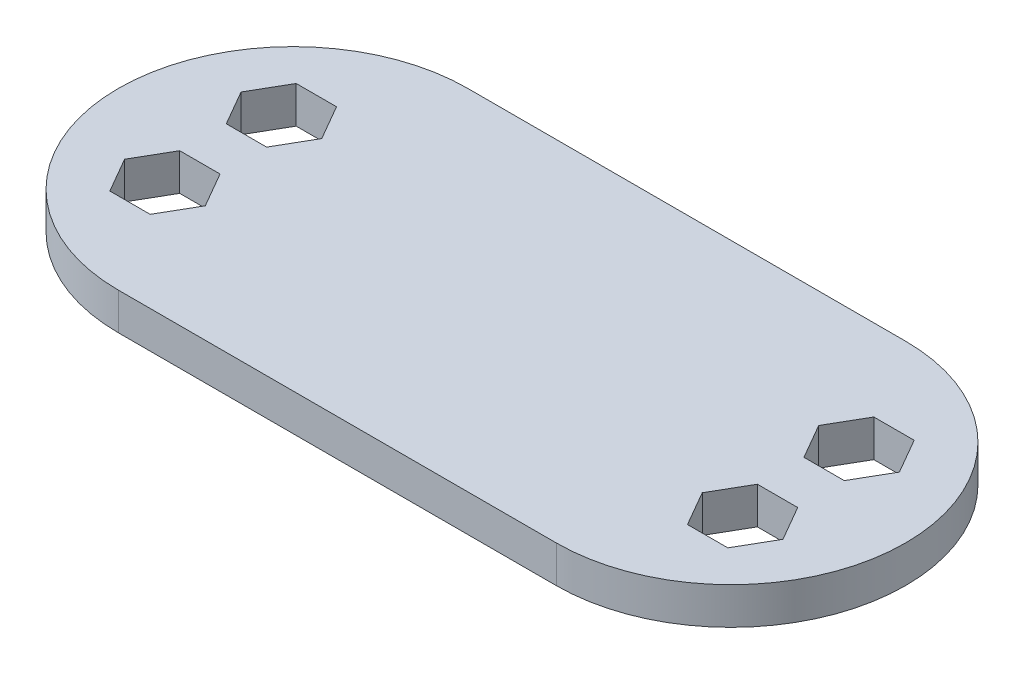
ISO-10303-21;
HEADER;
FILE_DESCRIPTION(('STEP AP214'),'2;1');
FILE_NAME('part.step','',(''),(''),'','','');
FILE_SCHEMA(('AUTOMOTIVE_DESIGN { 1 0 10303 214 1 1 1 1 }'));
ENDSEC;
DATA;
#1=APPLICATION_CONTEXT('core data for automotive mechanical design processes');
#2=APPLICATION_PROTOCOL_DEFINITION('international standard','automotive_design',2000,#1);
#3=PRODUCT_CONTEXT('',#1,'mechanical');
#4=PRODUCT('Part','Part','',(#3));
#5=PRODUCT_RELATED_PRODUCT_CATEGORY('part','',(#4));
#6=PRODUCT_DEFINITION_FORMATION('','',#4);
#7=PRODUCT_DEFINITION_CONTEXT('part definition',#1,'design');
#8=PRODUCT_DEFINITION('design','',#6,#7);
#9=PRODUCT_DEFINITION_SHAPE('','',#8);
#10=(LENGTH_UNIT() NAMED_UNIT(*) SI_UNIT(.MILLI.,.METRE.));
#11=(NAMED_UNIT(*) PLANE_ANGLE_UNIT() SI_UNIT($,.RADIAN.));
#12=(NAMED_UNIT(*) SI_UNIT($,.STERADIAN.) SOLID_ANGLE_UNIT());
#13=UNCERTAINTY_MEASURE_WITH_UNIT(LENGTH_MEASURE(1.E-05),#10,'distance_accuracy_value','');
#14=(GEOMETRIC_REPRESENTATION_CONTEXT(3) GLOBAL_UNCERTAINTY_ASSIGNED_CONTEXT((#13)) GLOBAL_UNIT_ASSIGNED_CONTEXT((#10,
#11,#12)) REPRESENTATION_CONTEXT('',''));
#15=CARTESIAN_POINT('',(0.,0.,0.));
#16=DIRECTION('',(0.,0.,1.));
#17=DIRECTION('',(1.,0.,0.));
#18=AXIS2_PLACEMENT_3D('',#15,#16,#17);
#19=CARTESIAN_POINT('',(-145.521414694939,3.175,14.0029406067574));
#20=DIRECTION('',(0.,1.,0.));
#21=DIRECTION('',(0.,0.,1.));
#22=AXIS2_PLACEMENT_3D('',#19,#20,#21);
#23=PLANE('',#22);
#24=CARTESIAN_POINT('',(-145.521414694939,3.175,14.0029406067574));
#25=DIRECTION('',(0.,1.,0.));
#26=DIRECTION('',(0.,0.,1.));
#27=AXIS2_PLACEMENT_3D('',#24,#25,#26);
#28=CIRCLE('',#27,15.);
#29=CARTESIAN_POINT('',(-145.521414694939,3.175,-0.997059393242624));
#30=VERTEX_POINT('',#29);
#31=CARTESIAN_POINT('',(-145.521414694939,3.175,29.0029406067574));
#32=VERTEX_POINT('',#31);
#33=EDGE_CURVE('E404',#30,#32,#28,.T.);
#34=ORIENTED_EDGE('',*,*,#33,.T.);
#35=DIRECTION('',(1.,0.,0.));
#36=VECTOR('',#35,1.);
#37=CARTESIAN_POINT('',(-145.521414694939,3.175,29.0029406067574));
#38=LINE('',#37,#36);
#39=CARTESIAN_POINT('',(-107.921414694939,3.175,29.0029406067574));
#40=VERTEX_POINT('',#39);
#41=EDGE_CURVE('E407',#32,#40,#38,.T.);
#42=ORIENTED_EDGE('',*,*,#41,.T.);
#43=CARTESIAN_POINT('',(-107.921414694939,3.175,14.0029406067574));
#44=DIRECTION('',(0.,1.,0.));
#45=DIRECTION('',(0.,0.,1.));
#46=AXIS2_PLACEMENT_3D('',#43,#44,#45);
#47=CIRCLE('',#46,15.);
#48=CARTESIAN_POINT('',(-107.921414694939,3.175,-0.997059393242629));
#49=VERTEX_POINT('',#48);
#50=EDGE_CURVE('E410',#40,#49,#47,.T.);
#51=ORIENTED_EDGE('',*,*,#50,.T.);
#52=DIRECTION('',(-1.,0.,0.));
#53=VECTOR('',#52,1.);
#54=CARTESIAN_POINT('',(-145.521414694939,3.175,-0.997059393242624));
#55=LINE('',#54,#53);
#56=EDGE_CURVE('E412',#49,#30,#55,.T.);
#57=ORIENTED_EDGE('',*,*,#56,.T.);
#58=EDGE_LOOP('',(#34,#42,#51,#57));
#59=FACE_BOUND('',#58,.T.);
#60=DIRECTION('',(0.500000000000001,0.,0.866025403784438));
#61=VECTOR('',#60,1.);
#62=CARTESIAN_POINT('',(-153.253465502508,3.175,22.0029406067574));
#63=LINE('',#62,#61);
#64=CARTESIAN_POINT('',(-154.985516310076,3.175,19.0029406067574));
#65=VERTEX_POINT('',#64);
#66=CARTESIAN_POINT('',(-153.253465502508,3.175,22.0029406067574));
#67=VERTEX_POINT('',#66);
#68=EDGE_CURVE('E361',#65,#67,#63,.T.);
#69=ORIENTED_EDGE('',*,*,#68,.F.);
#70=DIRECTION('',(-0.499999999999997,0.,0.86602540378444));
#71=VECTOR('',#70,1.);
#72=CARTESIAN_POINT('',(-154.985516310076,3.175,19.0029406067574));
#73=LINE('',#72,#71);
#74=CARTESIAN_POINT('',(-153.253465502508,3.175,16.0029406067574));
#75=VERTEX_POINT('',#74);
#76=EDGE_CURVE('E359',#75,#65,#73,.T.);
#77=ORIENTED_EDGE('',*,*,#76,.F.);
#78=DIRECTION('',(-1.,0.,0.));
#79=VECTOR('',#78,1.);
#80=CARTESIAN_POINT('',(-153.253465502508,3.175,16.0029406067574));
#81=LINE('',#80,#79);
#82=CARTESIAN_POINT('',(-149.78936388737,3.175,16.0029406067574));
#83=VERTEX_POINT('',#82);
#84=EDGE_CURVE('E371',#83,#75,#81,.T.);
#85=ORIENTED_EDGE('',*,*,#84,.F.);
#86=DIRECTION('',(-0.500000000000003,0.,-0.866025403784437));
#87=VECTOR('',#86,1.);
#88=CARTESIAN_POINT('',(-149.78936388737,3.175,16.0029406067574));
#89=LINE('',#88,#87);
#90=CARTESIAN_POINT('',(-148.057313079801,3.175,19.0029406067574));
#91=VERTEX_POINT('',#90);
#92=EDGE_CURVE('E368',#91,#83,#89,.T.);
#93=ORIENTED_EDGE('',*,*,#92,.F.);
#94=DIRECTION('',(0.500000000000002,0.,-0.866025403784437));
#95=VECTOR('',#94,1.);
#96=CARTESIAN_POINT('',(-148.057313079801,3.175,19.0029406067574));
#97=LINE('',#96,#95);
#98=CARTESIAN_POINT('',(-149.78936388737,3.175,22.0029406067574));
#99=VERTEX_POINT('',#98);
#100=EDGE_CURVE('E366',#99,#91,#97,.T.);
#101=ORIENTED_EDGE('',*,*,#100,.F.);
#102=DIRECTION('',(1.,0.,0.));
#103=VECTOR('',#102,1.);
#104=CARTESIAN_POINT('',(-149.78936388737,3.175,22.0029406067574));
#105=LINE('',#104,#103);
#106=EDGE_CURVE('E364',#67,#99,#105,.T.);
#107=ORIENTED_EDGE('',*,*,#106,.F.);
#108=EDGE_LOOP('',(#69,#77,#85,#93,#101,#107));
#109=FACE_BOUND('',#108,.T.);
#110=DIRECTION('',(0.500000000000003,0.,-0.866025403784437));
#111=VECTOR('',#110,1.);
#112=CARTESIAN_POINT('',(-149.78936388737,3.175,12.0029406067574));
#113=LINE('',#112,#111);
#114=CARTESIAN_POINT('',(-149.78936388737,3.175,12.0029406067574));
#115=VERTEX_POINT('',#114);
#116=CARTESIAN_POINT('',(-148.057313079801,3.175,9.00294060675738));
#117=VERTEX_POINT('',#116);
#118=EDGE_CURVE('E316',#115,#117,#113,.T.);
#119=ORIENTED_EDGE('',*,*,#118,.F.);
#120=DIRECTION('',(1.,0.,0.));
#121=VECTOR('',#120,1.);
#122=CARTESIAN_POINT('',(-153.253465502508,3.175,12.0029406067574));
#123=LINE('',#122,#121);
#124=CARTESIAN_POINT('',(-153.253465502508,3.175,12.0029406067574));
#125=VERTEX_POINT('',#124);
#126=EDGE_CURVE('E314',#125,#115,#123,.T.);
#127=ORIENTED_EDGE('',*,*,#126,.F.);
#128=DIRECTION('',(0.499999999999997,0.,0.86602540378444));
#129=VECTOR('',#128,1.);
#130=CARTESIAN_POINT('',(-154.985516310076,3.175,9.00294060675738));
#131=LINE('',#130,#129);
#132=CARTESIAN_POINT('',(-154.985516310076,3.175,9.00294060675738));
#133=VERTEX_POINT('',#132);
#134=EDGE_CURVE('E326',#133,#125,#131,.T.);
#135=ORIENTED_EDGE('',*,*,#134,.F.);
#136=DIRECTION('',(-0.500000000000001,0.,0.866025403784438));
#137=VECTOR('',#136,1.);
#138=CARTESIAN_POINT('',(-153.253465502508,3.175,6.00294060675738));
#139=LINE('',#138,#137);
#140=CARTESIAN_POINT('',(-153.253465502508,3.175,6.00294060675738));
#141=VERTEX_POINT('',#140);
#142=EDGE_CURVE('E323',#141,#133,#139,.T.);
#143=ORIENTED_EDGE('',*,*,#142,.F.);
#144=DIRECTION('',(-1.,0.,0.));
#145=VECTOR('',#144,1.);
#146=CARTESIAN_POINT('',(-149.78936388737,3.175,6.00294060675738));
#147=LINE('',#146,#145);
#148=CARTESIAN_POINT('',(-149.78936388737,3.175,6.00294060675738));
#149=VERTEX_POINT('',#148);
#150=EDGE_CURVE('E321',#149,#141,#147,.T.);
#151=ORIENTED_EDGE('',*,*,#150,.F.);
#152=DIRECTION('',(-0.500000000000002,0.,-0.866025403784437));
#153=VECTOR('',#152,1.);
#154=CARTESIAN_POINT('',(-148.057313079801,3.175,9.00294060675738));
#155=LINE('',#154,#153);
#156=EDGE_CURVE('E319',#117,#149,#155,.T.);
#157=ORIENTED_EDGE('',*,*,#156,.F.);
#158=EDGE_LOOP('',(#119,#127,#135,#143,#151,#157));
#159=FACE_BOUND('',#158,.T.);
#160=DIRECTION('',(-0.500000000000003,0.,0.866025403784437));
#161=VECTOR('',#160,1.);
#162=CARTESIAN_POINT('',(-103.653465502508,3.175,16.0029406067574));
#163=LINE('',#162,#161);
#164=CARTESIAN_POINT('',(-103.653465502508,3.175,16.0029406067574));
#165=VERTEX_POINT('',#164);
#166=CARTESIAN_POINT('',(-105.385516310076,3.175,19.0029406067574));
#167=VERTEX_POINT('',#166);
#168=EDGE_CURVE('E271',#165,#167,#163,.T.);
#169=ORIENTED_EDGE('',*,*,#168,.F.);
#170=DIRECTION('',(-1.,0.,0.));
#171=VECTOR('',#170,1.);
#172=CARTESIAN_POINT('',(-100.18936388737,3.175,16.0029406067574));
#173=LINE('',#172,#171);
#174=CARTESIAN_POINT('',(-100.18936388737,3.175,16.0029406067574));
#175=VERTEX_POINT('',#174);
#176=EDGE_CURVE('E269',#175,#165,#173,.T.);
#177=ORIENTED_EDGE('',*,*,#176,.F.);
#178=DIRECTION('',(-0.499999999999997,0.,-0.86602540378444));
#179=VECTOR('',#178,1.);
#180=CARTESIAN_POINT('',(-98.4573130798009,3.175,19.0029406067574));
#181=LINE('',#180,#179);
#182=CARTESIAN_POINT('',(-98.457313079801,3.175,19.0029406067574));
#183=VERTEX_POINT('',#182);
#184=EDGE_CURVE('E281',#183,#175,#181,.T.);
#185=ORIENTED_EDGE('',*,*,#184,.F.);
#186=DIRECTION('',(0.500000000000001,0.,-0.866025403784438));
#187=VECTOR('',#186,1.);
#188=CARTESIAN_POINT('',(-100.18936388737,3.175,22.0029406067574));
#189=LINE('',#188,#187);
#190=CARTESIAN_POINT('',(-100.18936388737,3.175,22.0029406067574));
#191=VERTEX_POINT('',#190);
#192=EDGE_CURVE('E278',#191,#183,#189,.T.);
#193=ORIENTED_EDGE('',*,*,#192,.F.);
#194=DIRECTION('',(1.,0.,0.));
#195=VECTOR('',#194,1.);
#196=CARTESIAN_POINT('',(-103.653465502508,3.175,22.0029406067574));
#197=LINE('',#196,#195);
#198=CARTESIAN_POINT('',(-103.653465502508,3.175,22.0029406067574));
#199=VERTEX_POINT('',#198);
#200=EDGE_CURVE('E276',#199,#191,#197,.T.);
#201=ORIENTED_EDGE('',*,*,#200,.F.);
#202=DIRECTION('',(0.500000000000002,0.,0.866025403784437));
#203=VECTOR('',#202,1.);
#204=CARTESIAN_POINT('',(-105.385516310076,3.175,19.0029406067574));
#205=LINE('',#204,#203);
#206=EDGE_CURVE('E274',#167,#199,#205,.T.);
#207=ORIENTED_EDGE('',*,*,#206,.F.);
#208=EDGE_LOOP('',(#169,#177,#185,#193,#201,#207));
#209=FACE_BOUND('',#208,.T.);
#210=DIRECTION('',(-0.500000000000001,0.,-0.866025403784438));
#211=VECTOR('',#210,1.);
#212=CARTESIAN_POINT('',(-100.18936388737,3.175,6.00294060675738));
#213=LINE('',#212,#211);
#214=CARTESIAN_POINT('',(-98.4573130798009,3.175,9.00294060675738));
#215=VERTEX_POINT('',#214);
#216=CARTESIAN_POINT('',(-100.18936388737,3.175,6.00294060675738));
#217=VERTEX_POINT('',#216);
#218=EDGE_CURVE('E226',#215,#217,#213,.T.);
#219=ORIENTED_EDGE('',*,*,#218,.F.);
#220=DIRECTION('',(0.499999999999997,0.,-0.86602540378444));
#221=VECTOR('',#220,1.);
#222=CARTESIAN_POINT('',(-98.4573130798009,3.175,9.00294060675738));
#223=LINE('',#222,#221);
#224=CARTESIAN_POINT('',(-100.18936388737,3.175,12.0029406067574));
#225=VERTEX_POINT('',#224);
#226=EDGE_CURVE('E218',#225,#215,#223,.T.);
#227=ORIENTED_EDGE('',*,*,#226,.F.);
#228=DIRECTION('',(1.,0.,0.));
#229=VECTOR('',#228,1.);
#230=CARTESIAN_POINT('',(-100.18936388737,3.175,12.0029406067574));
#231=LINE('',#230,#229);
#232=CARTESIAN_POINT('',(-103.653465502508,3.175,12.0029406067574));
#233=VERTEX_POINT('',#232);
#234=EDGE_CURVE('E247',#233,#225,#231,.T.);
#235=ORIENTED_EDGE('',*,*,#234,.F.);
#236=DIRECTION('',(0.500000000000003,0.,0.866025403784437));
#237=VECTOR('',#236,1.);
#238=CARTESIAN_POINT('',(-103.653465502508,3.175,12.0029406067574));
#239=LINE('',#238,#237);
#240=CARTESIAN_POINT('',(-105.385516310076,3.175,9.00294060675738));
#241=VERTEX_POINT('',#240);
#242=EDGE_CURVE('E245',#241,#233,#239,.T.);
#243=ORIENTED_EDGE('',*,*,#242,.F.);
#244=DIRECTION('',(-0.500000000000002,0.,0.866025403784437));
#245=VECTOR('',#244,1.);
#246=CARTESIAN_POINT('',(-105.385516310076,3.175,9.00294060675738));
#247=LINE('',#246,#245);
#248=CARTESIAN_POINT('',(-103.653465502508,3.175,6.00294060675738));
#249=VERTEX_POINT('',#248);
#250=EDGE_CURVE('E241',#249,#241,#247,.T.);
#251=ORIENTED_EDGE('',*,*,#250,.F.);
#252=DIRECTION('',(-1.,0.,0.));
#253=VECTOR('',#252,1.);
#254=CARTESIAN_POINT('',(-103.653465502508,3.175,6.00294060675738));
#255=LINE('',#254,#253);
#256=EDGE_CURVE('E239',#217,#249,#255,.T.);
#257=ORIENTED_EDGE('',*,*,#256,.F.);
#258=EDGE_LOOP('',(#219,#227,#235,#243,#251,#257));
#259=FACE_BOUND('',#258,.T.);
#260=ADVANCED_FACE('F33',(#59,#109,#159,#209,#259),#23,.T.);
#261=CARTESIAN_POINT('',(-145.521414694939,0.,14.0029406067574));
#262=DIRECTION('',(0.,1.,0.));
#263=DIRECTION('',(0.,0.,1.));
#264=AXIS2_PLACEMENT_3D('',#261,#262,#263);
#265=PLANE('',#264);
#266=DIRECTION('',(-1.,0.,0.));
#267=VECTOR('',#266,1.);
#268=CARTESIAN_POINT('',(-100.18936388737,0.,16.0029406067574));
#269=LINE('',#268,#267);
#270=CARTESIAN_POINT('',(-100.18936388737,0.,16.0029406067574));
#271=VERTEX_POINT('',#270);
#272=CARTESIAN_POINT('',(-103.653465502508,0.,16.0029406067574));
#273=VERTEX_POINT('',#272);
#274=EDGE_CURVE('E234',#271,#273,#269,.T.);
#275=ORIENTED_EDGE('',*,*,#274,.T.);
#276=DIRECTION('',(-0.500000000000003,0.,0.866025403784437));
#277=VECTOR('',#276,1.);
#278=CARTESIAN_POINT('',(-103.653465502508,0.,16.0029406067574));
#279=LINE('',#278,#277);
#280=CARTESIAN_POINT('',(-105.385516310076,0.,19.0029406067574));
#281=VERTEX_POINT('',#280);
#282=EDGE_CURVE('E286',#273,#281,#279,.T.);
#283=ORIENTED_EDGE('',*,*,#282,.T.);
#284=DIRECTION('',(0.500000000000002,0.,0.866025403784437));
#285=VECTOR('',#284,1.);
#286=CARTESIAN_POINT('',(-105.385516310076,0.,19.0029406067574));
#287=LINE('',#286,#285);
#288=CARTESIAN_POINT('',(-103.653465502508,0.,22.0029406067574));
#289=VERTEX_POINT('',#288);
#290=EDGE_CURVE('E289',#281,#289,#287,.T.);
#291=ORIENTED_EDGE('',*,*,#290,.T.);
#292=DIRECTION('',(1.,0.,0.));
#293=VECTOR('',#292,1.);
#294=CARTESIAN_POINT('',(-103.653465502508,0.,22.0029406067574));
#295=LINE('',#294,#293);
#296=CARTESIAN_POINT('',(-100.18936388737,0.,22.0029406067574));
#297=VERTEX_POINT('',#296);
#298=EDGE_CURVE('E292',#289,#297,#295,.T.);
#299=ORIENTED_EDGE('',*,*,#298,.T.);
#300=DIRECTION('',(0.500000000000001,0.,-0.866025403784438));
#301=VECTOR('',#300,1.);
#302=CARTESIAN_POINT('',(-100.18936388737,0.,22.0029406067574));
#303=LINE('',#302,#301);
#304=CARTESIAN_POINT('',(-98.4573130798009,0.,19.0029406067574));
#305=VERTEX_POINT('',#304);
#306=EDGE_CURVE('E295',#297,#305,#303,.T.);
#307=ORIENTED_EDGE('',*,*,#306,.T.);
#308=DIRECTION('',(-0.499999999999997,0.,-0.86602540378444));
#309=VECTOR('',#308,1.);
#310=CARTESIAN_POINT('',(-98.4573130798009,0.,19.0029406067574));
#311=LINE('',#310,#309);
#312=EDGE_CURVE('E272',#305,#271,#311,.T.);
#313=ORIENTED_EDGE('',*,*,#312,.T.);
#314=EDGE_LOOP('',(#275,#283,#291,#299,#307,#313));
#315=FACE_BOUND('',#314,.T.);
#316=DIRECTION('',(-0.499999999999997,0.,0.86602540378444));
#317=VECTOR('',#316,1.);
#318=CARTESIAN_POINT('',(-154.985516310076,0.,19.0029406067574));
#319=LINE('',#318,#317);
#320=CARTESIAN_POINT('',(-153.253465502508,0.,16.0029406067574));
#321=VERTEX_POINT('',#320);
#322=CARTESIAN_POINT('',(-154.985516310076,0.,19.0029406067574));
#323=VERTEX_POINT('',#322);
#324=EDGE_CURVE('E358',#321,#323,#319,.T.);
#325=ORIENTED_EDGE('',*,*,#324,.T.);
#326=DIRECTION('',(0.500000000000001,0.,0.866025403784438));
#327=VECTOR('',#326,1.);
#328=CARTESIAN_POINT('',(-153.253465502508,0.,22.0029406067574));
#329=LINE('',#328,#327);
#330=CARTESIAN_POINT('',(-153.253465502508,0.,22.0029406067574));
#331=VERTEX_POINT('',#330);
#332=EDGE_CURVE('E376',#323,#331,#329,.T.);
#333=ORIENTED_EDGE('',*,*,#332,.T.);
#334=DIRECTION('',(1.,0.,0.));
#335=VECTOR('',#334,1.);
#336=CARTESIAN_POINT('',(-149.78936388737,0.,22.0029406067574));
#337=LINE('',#336,#335);
#338=CARTESIAN_POINT('',(-149.78936388737,0.,22.0029406067574));
#339=VERTEX_POINT('',#338);
#340=EDGE_CURVE('E379',#331,#339,#337,.T.);
#341=ORIENTED_EDGE('',*,*,#340,.T.);
#342=DIRECTION('',(0.500000000000002,0.,-0.866025403784437));
#343=VECTOR('',#342,1.);
#344=CARTESIAN_POINT('',(-148.057313079801,0.,19.0029406067574));
#345=LINE('',#344,#343);
#346=CARTESIAN_POINT('',(-148.057313079801,0.,19.0029406067574));
#347=VERTEX_POINT('',#346);
#348=EDGE_CURVE('E382',#339,#347,#345,.T.);
#349=ORIENTED_EDGE('',*,*,#348,.T.);
#350=DIRECTION('',(-0.500000000000003,0.,-0.866025403784437));
#351=VECTOR('',#350,1.);
#352=CARTESIAN_POINT('',(-149.78936388737,0.,16.0029406067574));
#353=LINE('',#352,#351);
#354=CARTESIAN_POINT('',(-149.78936388737,0.,16.0029406067574));
#355=VERTEX_POINT('',#354);
#356=EDGE_CURVE('E385',#347,#355,#353,.T.);
#357=ORIENTED_EDGE('',*,*,#356,.T.);
#358=DIRECTION('',(-1.,0.,0.));
#359=VECTOR('',#358,1.);
#360=CARTESIAN_POINT('',(-153.253465502508,0.,16.0029406067574));
#361=LINE('',#360,#359);
#362=EDGE_CURVE('E362',#355,#321,#361,.T.);
#363=ORIENTED_EDGE('',*,*,#362,.T.);
#364=EDGE_LOOP('',(#325,#333,#341,#349,#357,#363));
#365=FACE_BOUND('',#364,.T.);
#366=CARTESIAN_POINT('',(-145.521414694939,0.,14.0029406067574));
#367=DIRECTION('',(0.,1.,0.));
#368=DIRECTION('',(0.,0.,1.));
#369=AXIS2_PLACEMENT_3D('',#366,#367,#368);
#370=CIRCLE('',#369,15.);
#371=CARTESIAN_POINT('',(-145.521414694939,0.,-0.997059393242624));
#372=VERTEX_POINT('',#371);
#373=CARTESIAN_POINT('',(-145.521414694939,0.,29.0029406067574));
#374=VERTEX_POINT('',#373);
#375=EDGE_CURVE('E403',#372,#374,#370,.T.);
#376=ORIENTED_EDGE('',*,*,#375,.F.);
#377=DIRECTION('',(-1.,0.,0.));
#378=VECTOR('',#377,1.);
#379=CARTESIAN_POINT('',(-145.521414694939,0.,-0.997059393242624));
#380=LINE('',#379,#378);
#381=CARTESIAN_POINT('',(-107.921414694939,0.,-0.997059393242629));
#382=VERTEX_POINT('',#381);
#383=EDGE_CURVE('E408',#382,#372,#380,.T.);
#384=ORIENTED_EDGE('',*,*,#383,.F.);
#385=CARTESIAN_POINT('',(-107.921414694939,0.,14.0029406067574));
#386=DIRECTION('',(0.,1.,0.));
#387=DIRECTION('',(0.,0.,1.));
#388=AXIS2_PLACEMENT_3D('',#385,#386,#387);
#389=CIRCLE('',#388,15.);
#390=CARTESIAN_POINT('',(-107.921414694939,0.,29.0029406067574));
#391=VERTEX_POINT('',#390);
#392=EDGE_CURVE('E419',#391,#382,#389,.T.);
#393=ORIENTED_EDGE('',*,*,#392,.F.);
#394=DIRECTION('',(1.,0.,0.));
#395=VECTOR('',#394,1.);
#396=CARTESIAN_POINT('',(-145.521414694939,0.,29.0029406067574));
#397=LINE('',#396,#395);
#398=EDGE_CURVE('E417',#374,#391,#397,.T.);
#399=ORIENTED_EDGE('',*,*,#398,.F.);
#400=EDGE_LOOP('',(#376,#384,#393,#399));
#401=FACE_BOUND('',#400,.T.);
#402=DIRECTION('',(1.,0.,0.));
#403=VECTOR('',#402,1.);
#404=CARTESIAN_POINT('',(-153.253465502508,0.,12.0029406067574));
#405=LINE('',#404,#403);
#406=CARTESIAN_POINT('',(-153.253465502508,0.,12.0029406067574));
#407=VERTEX_POINT('',#406);
#408=CARTESIAN_POINT('',(-149.78936388737,0.,12.0029406067574));
#409=VERTEX_POINT('',#408);
#410=EDGE_CURVE('E313',#407,#409,#405,.T.);
#411=ORIENTED_EDGE('',*,*,#410,.T.);
#412=DIRECTION('',(0.500000000000003,0.,-0.866025403784437));
#413=VECTOR('',#412,1.);
#414=CARTESIAN_POINT('',(-149.78936388737,0.,12.0029406067574));
#415=LINE('',#414,#413);
#416=CARTESIAN_POINT('',(-148.057313079801,0.,9.00294060675738));
#417=VERTEX_POINT('',#416);
#418=EDGE_CURVE('E331',#409,#417,#415,.T.);
#419=ORIENTED_EDGE('',*,*,#418,.T.);
#420=DIRECTION('',(-0.500000000000002,0.,-0.866025403784437));
#421=VECTOR('',#420,1.);
#422=CARTESIAN_POINT('',(-148.057313079801,0.,9.00294060675738));
#423=LINE('',#422,#421);
#424=CARTESIAN_POINT('',(-149.78936388737,0.,6.00294060675738));
#425=VERTEX_POINT('',#424);
#426=EDGE_CURVE('E334',#417,#425,#423,.T.);
#427=ORIENTED_EDGE('',*,*,#426,.T.);
#428=DIRECTION('',(-1.,0.,0.));
#429=VECTOR('',#428,1.);
#430=CARTESIAN_POINT('',(-149.78936388737,0.,6.00294060675738));
#431=LINE('',#430,#429);
#432=CARTESIAN_POINT('',(-153.253465502508,0.,6.00294060675738));
#433=VERTEX_POINT('',#432);
#434=EDGE_CURVE('E337',#425,#433,#431,.T.);
#435=ORIENTED_EDGE('',*,*,#434,.T.);
#436=DIRECTION('',(-0.500000000000001,0.,0.866025403784438));
#437=VECTOR('',#436,1.);
#438=CARTESIAN_POINT('',(-153.253465502508,0.,6.00294060675738));
#439=LINE('',#438,#437);
#440=CARTESIAN_POINT('',(-154.985516310076,0.,9.00294060675738));
#441=VERTEX_POINT('',#440);
#442=EDGE_CURVE('E340',#433,#441,#439,.T.);
#443=ORIENTED_EDGE('',*,*,#442,.T.);
#444=DIRECTION('',(0.499999999999997,0.,0.86602540378444));
#445=VECTOR('',#444,1.);
#446=CARTESIAN_POINT('',(-154.985516310076,0.,9.00294060675738));
#447=LINE('',#446,#445);
#448=EDGE_CURVE('E317',#441,#407,#447,.T.);
#449=ORIENTED_EDGE('',*,*,#448,.T.);
#450=EDGE_LOOP('',(#411,#419,#427,#435,#443,#449));
#451=FACE_BOUND('',#450,.T.);
#452=DIRECTION('',(0.499999999999997,0.,-0.86602540378444));
#453=VECTOR('',#452,1.);
#454=CARTESIAN_POINT('',(-98.4573130798009,0.,9.00294060675738));
#455=LINE('',#454,#453);
#456=CARTESIAN_POINT('',(-100.18936388737,0.,12.0029406067574));
#457=VERTEX_POINT('',#456);
#458=CARTESIAN_POINT('',(-98.4573130798009,0.,9.00294060675738));
#459=VERTEX_POINT('',#458);
#460=EDGE_CURVE('E56',#457,#459,#455,.T.);
#461=ORIENTED_EDGE('',*,*,#460,.T.);
#462=DIRECTION('',(-0.500000000000001,0.,-0.866025403784438));
#463=VECTOR('',#462,1.);
#464=CARTESIAN_POINT('',(-100.18936388737,0.,6.00294060675738));
#465=LINE('',#464,#463);
#466=CARTESIAN_POINT('',(-100.18936388737,0.,6.00294060675738));
#467=VERTEX_POINT('',#466);
#468=EDGE_CURVE('E233',#459,#467,#465,.T.);
#469=ORIENTED_EDGE('',*,*,#468,.T.);
#470=DIRECTION('',(-1.,0.,0.));
#471=VECTOR('',#470,1.);
#472=CARTESIAN_POINT('',(-103.653465502508,0.,6.00294060675738));
#473=LINE('',#472,#471);
#474=CARTESIAN_POINT('',(-103.653465502508,0.,6.00294060675738));
#475=VERTEX_POINT('',#474);
#476=EDGE_CURVE('E251',#467,#475,#473,.T.);
#477=ORIENTED_EDGE('',*,*,#476,.T.);
#478=DIRECTION('',(-0.500000000000002,0.,0.866025403784437));
#479=VECTOR('',#478,1.);
#480=CARTESIAN_POINT('',(-105.385516310076,0.,9.00294060675738));
#481=LINE('',#480,#479);
#482=CARTESIAN_POINT('',(-105.385516310076,0.,9.00294060675738));
#483=VERTEX_POINT('',#482);
#484=EDGE_CURVE('E254',#475,#483,#481,.T.);
#485=ORIENTED_EDGE('',*,*,#484,.T.);
#486=DIRECTION('',(0.500000000000003,0.,0.866025403784437));
#487=VECTOR('',#486,1.);
#488=CARTESIAN_POINT('',(-103.653465502508,0.,12.0029406067574));
#489=LINE('',#488,#487);
#490=CARTESIAN_POINT('',(-103.653465502508,0.,12.0029406067574));
#491=VERTEX_POINT('',#490);
#492=EDGE_CURVE('E257',#483,#491,#489,.T.);
#493=ORIENTED_EDGE('',*,*,#492,.T.);
#494=DIRECTION('',(1.,0.,0.));
#495=VECTOR('',#494,1.);
#496=CARTESIAN_POINT('',(-100.18936388737,0.,12.0029406067574));
#497=LINE('',#496,#495);
#498=EDGE_CURVE('E227',#491,#457,#497,.T.);
#499=ORIENTED_EDGE('',*,*,#498,.T.);
#500=EDGE_LOOP('',(#461,#469,#477,#485,#493,#499));
#501=FACE_BOUND('',#500,.T.);
#502=ADVANCED_FACE('F437',(#315,#365,#401,#451,#501),#265,.F.);
#503=CARTESIAN_POINT('',(-145.521414694939,3.175,14.0029406067574));
#504=DIRECTION('',(0.,-1.,0.));
#505=DIRECTION('',(0.,0.,-1.));
#506=AXIS2_PLACEMENT_3D('',#503,#504,#505);
#507=CYLINDRICAL_SURFACE('',#506,15.);
#508=ORIENTED_EDGE('',*,*,#375,.T.);
#509=DIRECTION('',(0.,-1.,0.));
#510=VECTOR('',#509,1.);
#511=CARTESIAN_POINT('',(-145.521414694939,3.175,29.0029406067574));
#512=LINE('',#511,#510);
#513=EDGE_CURVE('E11',#32,#374,#512,.T.);
#514=ORIENTED_EDGE('',*,*,#513,.F.);
#515=ORIENTED_EDGE('',*,*,#33,.F.);
#516=DIRECTION('',(0.,-1.,0.));
#517=VECTOR('',#516,1.);
#518=CARTESIAN_POINT('',(-145.521414694939,3.175,-0.997059393242624));
#519=LINE('',#518,#517);
#520=EDGE_CURVE('E414',#30,#372,#519,.T.);
#521=ORIENTED_EDGE('',*,*,#520,.T.);
#522=EDGE_LOOP('',(#508,#514,#515,#521));
#523=FACE_BOUND('',#522,.T.);
#524=ADVANCED_FACE('F35',(#523),#507,.T.);
#525=CARTESIAN_POINT('',(-145.521414694939,3.175,29.0029406067574));
#526=DIRECTION('',(0.,0.,-1.));
#527=DIRECTION('',(-1.,0.,0.));
#528=AXIS2_PLACEMENT_3D('',#525,#526,#527);
#529=PLANE('',#528);
#530=ORIENTED_EDGE('',*,*,#398,.T.);
#531=DIRECTION('',(0.,-1.,0.));
#532=VECTOR('',#531,1.);
#533=CARTESIAN_POINT('',(-107.921414694939,3.175,29.0029406067574));
#534=LINE('',#533,#532);
#535=EDGE_CURVE('E41',#40,#391,#534,.T.);
#536=ORIENTED_EDGE('',*,*,#535,.F.);
#537=ORIENTED_EDGE('',*,*,#41,.F.);
#538=ORIENTED_EDGE('',*,*,#513,.T.);
#539=EDGE_LOOP('',(#530,#536,#537,#538));
#540=FACE_BOUND('',#539,.T.);
#541=ADVANCED_FACE('F448',(#540),#529,.F.);
#542=CARTESIAN_POINT('',(-107.921414694939,3.175,14.0029406067574));
#543=DIRECTION('',(0.,-1.,0.));
#544=DIRECTION('',(0.,0.,-1.));
#545=AXIS2_PLACEMENT_3D('',#542,#543,#544);
#546=CYLINDRICAL_SURFACE('',#545,15.);
#547=ORIENTED_EDGE('',*,*,#392,.T.);
#548=DIRECTION('',(0.,-1.,0.));
#549=VECTOR('',#548,1.);
#550=CARTESIAN_POINT('',(-107.921414694939,3.175,-0.997059393242629));
#551=LINE('',#550,#549);
#552=EDGE_CURVE('E424',#49,#382,#551,.T.);
#553=ORIENTED_EDGE('',*,*,#552,.F.);
#554=ORIENTED_EDGE('',*,*,#50,.F.);
#555=ORIENTED_EDGE('',*,*,#535,.T.);
#556=EDGE_LOOP('',(#547,#553,#554,#555));
#557=FACE_BOUND('',#556,.T.);
#558=ADVANCED_FACE('F431',(#557),#546,.T.);
#559=CARTESIAN_POINT('',(-145.521414694939,3.175,-0.997059393242624));
#560=DIRECTION('',(0.,0.,1.));
#561=DIRECTION('',(1.,0.,0.));
#562=AXIS2_PLACEMENT_3D('',#559,#560,#561);
#563=PLANE('',#562);
#564=ORIENTED_EDGE('',*,*,#383,.T.);
#565=ORIENTED_EDGE('',*,*,#520,.F.);
#566=ORIENTED_EDGE('',*,*,#56,.F.);
#567=ORIENTED_EDGE('',*,*,#552,.T.);
#568=EDGE_LOOP('',(#564,#565,#566,#567));
#569=FACE_BOUND('',#568,.T.);
#570=ADVANCED_FACE('F441',(#569),#563,.F.);
#571=CARTESIAN_POINT('',(-154.985516310076,3.175,19.0029406067574));
#572=DIRECTION('',(0.86602540378444,0.,0.499999999999997));
#573=DIRECTION('',(0.499999999999997,0.,-0.86602540378444));
#574=AXIS2_PLACEMENT_3D('',#571,#572,#573);
#575=PLANE('',#574);
#576=ORIENTED_EDGE('',*,*,#324,.F.);
#577=DIRECTION('',(0.,-1.,0.));
#578=VECTOR('',#577,1.);
#579=CARTESIAN_POINT('',(-153.253465502508,3.175,16.0029406067574));
#580=LINE('',#579,#578);
#581=EDGE_CURVE('E373',#75,#321,#580,.T.);
#582=ORIENTED_EDGE('',*,*,#581,.F.);
#583=ORIENTED_EDGE('',*,*,#76,.T.);
#584=DIRECTION('',(0.,-1.,0.));
#585=VECTOR('',#584,1.);
#586=CARTESIAN_POINT('',(-154.985516310076,3.175,19.0029406067574));
#587=LINE('',#586,#585);
#588=EDGE_CURVE('E400',#65,#323,#587,.T.);
#589=ORIENTED_EDGE('',*,*,#588,.T.);
#590=EDGE_LOOP('',(#576,#582,#583,#589));
#591=FACE_BOUND('',#590,.T.);
#592=ADVANCED_FACE('F463',(#591),#575,.T.);
#593=CARTESIAN_POINT('',(-153.253465502508,3.175,22.0029406067574));
#594=DIRECTION('',(0.866025403784438,0.,-0.500000000000001));
#595=DIRECTION('',(-0.500000000000002,0.,-0.866025403784438));
#596=AXIS2_PLACEMENT_3D('',#593,#594,#595);
#597=PLANE('',#596);
#598=ORIENTED_EDGE('',*,*,#332,.F.);
#599=ORIENTED_EDGE('',*,*,#588,.F.);
#600=ORIENTED_EDGE('',*,*,#68,.T.);
#601=DIRECTION('',(0.,-1.,0.));
#602=VECTOR('',#601,1.);
#603=CARTESIAN_POINT('',(-153.253465502508,3.175,22.0029406067574));
#604=LINE('',#603,#602);
#605=EDGE_CURVE('E398',#67,#331,#604,.T.);
#606=ORIENTED_EDGE('',*,*,#605,.T.);
#607=EDGE_LOOP('',(#598,#599,#600,#606));
#608=FACE_BOUND('',#607,.T.);
#609=ADVANCED_FACE('F470',(#608),#597,.T.);
#610=CARTESIAN_POINT('',(-149.78936388737,3.175,22.0029406067574));
#611=DIRECTION('',(0.,0.,-1.));
#612=DIRECTION('',(-1.,0.,0.));
#613=AXIS2_PLACEMENT_3D('',#610,#611,#612);
#614=PLANE('',#613);
#615=ORIENTED_EDGE('',*,*,#340,.F.);
#616=ORIENTED_EDGE('',*,*,#605,.F.);
#617=ORIENTED_EDGE('',*,*,#106,.T.);
#618=DIRECTION('',(0.,-1.,0.));
#619=VECTOR('',#618,1.);
#620=CARTESIAN_POINT('',(-149.78936388737,3.175,22.0029406067574));
#621=LINE('',#620,#619);
#622=EDGE_CURVE('E396',#99,#339,#621,.T.);
#623=ORIENTED_EDGE('',*,*,#622,.T.);
#624=EDGE_LOOP('',(#615,#616,#617,#623));
#625=FACE_BOUND('',#624,.T.);
#626=ADVANCED_FACE('F475',(#625),#614,.T.);
#627=CARTESIAN_POINT('',(-148.057313079801,3.175,19.0029406067574));
#628=DIRECTION('',(-0.866025403784437,0.,-0.500000000000002));
#629=DIRECTION('',(-0.500000000000002,0.,0.866025403784438));
#630=AXIS2_PLACEMENT_3D('',#627,#628,#629);
#631=PLANE('',#630);
#632=ORIENTED_EDGE('',*,*,#348,.F.);
#633=ORIENTED_EDGE('',*,*,#622,.F.);
#634=ORIENTED_EDGE('',*,*,#100,.T.);
#635=DIRECTION('',(0.,-1.,0.));
#636=VECTOR('',#635,1.);
#637=CARTESIAN_POINT('',(-148.057313079801,3.175,19.0029406067574));
#638=LINE('',#637,#636);
#639=EDGE_CURVE('E394',#91,#347,#638,.T.);
#640=ORIENTED_EDGE('',*,*,#639,.T.);
#641=EDGE_LOOP('',(#632,#633,#634,#640));
#642=FACE_BOUND('',#641,.T.);
#643=ADVANCED_FACE('F500',(#642),#631,.T.);
#644=CARTESIAN_POINT('',(-149.78936388737,3.175,16.0029406067574));
#645=DIRECTION('',(-0.866025403784437,0.,0.500000000000003));
#646=DIRECTION('',(0.500000000000003,0.,0.866025403784437));
#647=AXIS2_PLACEMENT_3D('',#644,#645,#646);
#648=PLANE('',#647);
#649=ORIENTED_EDGE('',*,*,#356,.F.);
#650=ORIENTED_EDGE('',*,*,#639,.F.);
#651=ORIENTED_EDGE('',*,*,#92,.T.);
#652=DIRECTION('',(0.,-1.,0.));
#653=VECTOR('',#652,1.);
#654=CARTESIAN_POINT('',(-149.78936388737,3.175,16.0029406067574));
#655=LINE('',#654,#653);
#656=EDGE_CURVE('E392',#83,#355,#655,.T.);
#657=ORIENTED_EDGE('',*,*,#656,.T.);
#658=EDGE_LOOP('',(#649,#650,#651,#657));
#659=FACE_BOUND('',#658,.T.);
#660=ADVANCED_FACE('F489',(#659),#648,.T.);
#661=CARTESIAN_POINT('',(-153.253465502508,3.175,16.0029406067574));
#662=DIRECTION('',(0.,0.,1.));
#663=DIRECTION('',(1.,0.,0.));
#664=AXIS2_PLACEMENT_3D('',#661,#662,#663);
#665=PLANE('',#664);
#666=ORIENTED_EDGE('',*,*,#362,.F.);
#667=ORIENTED_EDGE('',*,*,#656,.F.);
#668=ORIENTED_EDGE('',*,*,#84,.T.);
#669=ORIENTED_EDGE('',*,*,#581,.T.);
#670=EDGE_LOOP('',(#666,#667,#668,#669));
#671=FACE_BOUND('',#670,.T.);
#672=ADVANCED_FACE('F483',(#671),#665,.T.);
#673=CARTESIAN_POINT('',(-153.253465502508,3.175,12.0029406067574));
#674=DIRECTION('',(0.,0.,-1.));
#675=DIRECTION('',(-1.,0.,0.));
#676=AXIS2_PLACEMENT_3D('',#673,#674,#675);
#677=PLANE('',#676);
#678=ORIENTED_EDGE('',*,*,#410,.F.);
#679=DIRECTION('',(0.,-1.,0.));
#680=VECTOR('',#679,1.);
#681=CARTESIAN_POINT('',(-153.253465502508,3.175,12.0029406067574));
#682=LINE('',#681,#680);
#683=EDGE_CURVE('E328',#125,#407,#682,.T.);
#684=ORIENTED_EDGE('',*,*,#683,.F.);
#685=ORIENTED_EDGE('',*,*,#126,.T.);
#686=DIRECTION('',(0.,-1.,0.));
#687=VECTOR('',#686,1.);
#688=CARTESIAN_POINT('',(-149.78936388737,3.175,12.0029406067574));
#689=LINE('',#688,#687);
#690=EDGE_CURVE('E355',#115,#409,#689,.T.);
#691=ORIENTED_EDGE('',*,*,#690,.T.);
#692=EDGE_LOOP('',(#678,#684,#685,#691));
#693=FACE_BOUND('',#692,.T.);
#694=ADVANCED_FACE('F512',(#693),#677,.T.);
#695=CARTESIAN_POINT('',(-149.78936388737,3.175,12.0029406067574));
#696=DIRECTION('',(-0.866025403784437,0.,-0.500000000000003));
#697=DIRECTION('',(-0.500000000000003,0.,0.866025403784437));
#698=AXIS2_PLACEMENT_3D('',#695,#696,#697);
#699=PLANE('',#698);
#700=ORIENTED_EDGE('',*,*,#418,.F.);
#701=ORIENTED_EDGE('',*,*,#690,.F.);
#702=ORIENTED_EDGE('',*,*,#118,.T.);
#703=DIRECTION('',(0.,-1.,0.));
#704=VECTOR('',#703,1.);
#705=CARTESIAN_POINT('',(-148.057313079801,3.175,9.00294060675738));
#706=LINE('',#705,#704);
#707=EDGE_CURVE('E353',#117,#417,#706,.T.);
#708=ORIENTED_EDGE('',*,*,#707,.T.);
#709=EDGE_LOOP('',(#700,#701,#702,#708));
#710=FACE_BOUND('',#709,.T.);
#711=ADVANCED_FACE('F515',(#710),#699,.T.);
#712=CARTESIAN_POINT('',(-148.057313079801,3.175,9.00294060675738));
#713=DIRECTION('',(-0.866025403784437,0.,0.500000000000002));
#714=DIRECTION('',(0.500000000000002,0.,0.866025403784438));
#715=AXIS2_PLACEMENT_3D('',#712,#713,#714);
#716=PLANE('',#715);
#717=ORIENTED_EDGE('',*,*,#426,.F.);
#718=ORIENTED_EDGE('',*,*,#707,.F.);
#719=ORIENTED_EDGE('',*,*,#156,.T.);
#720=DIRECTION('',(0.,-1.,0.));
#721=VECTOR('',#720,1.);
#722=CARTESIAN_POINT('',(-149.78936388737,3.175,6.00294060675738));
#723=LINE('',#722,#721);
#724=EDGE_CURVE('E351',#149,#425,#723,.T.);
#725=ORIENTED_EDGE('',*,*,#724,.T.);
#726=EDGE_LOOP('',(#717,#718,#719,#725));
#727=FACE_BOUND('',#726,.T.);
#728=ADVANCED_FACE('F519',(#727),#716,.T.);
#729=CARTESIAN_POINT('',(-149.78936388737,3.175,6.00294060675738));
#730=DIRECTION('',(0.,0.,1.));
#731=DIRECTION('',(1.,0.,0.));
#732=AXIS2_PLACEMENT_3D('',#729,#730,#731);
#733=PLANE('',#732);
#734=ORIENTED_EDGE('',*,*,#434,.F.);
#735=ORIENTED_EDGE('',*,*,#724,.F.);
#736=ORIENTED_EDGE('',*,*,#150,.T.);
#737=DIRECTION('',(0.,-1.,0.));
#738=VECTOR('',#737,1.);
#739=CARTESIAN_POINT('',(-153.253465502508,3.175,6.00294060675738));
#740=LINE('',#739,#738);
#741=EDGE_CURVE('E349',#141,#433,#740,.T.);
#742=ORIENTED_EDGE('',*,*,#741,.T.);
#743=EDGE_LOOP('',(#734,#735,#736,#742));
#744=FACE_BOUND('',#743,.T.);
#745=ADVANCED_FACE('F523',(#744),#733,.T.);
#746=CARTESIAN_POINT('',(-153.253465502508,3.175,6.00294060675738));
#747=DIRECTION('',(0.866025403784438,0.,0.500000000000001));
#748=DIRECTION('',(0.500000000000002,0.,-0.866025403784438));
#749=AXIS2_PLACEMENT_3D('',#746,#747,#748);
#750=PLANE('',#749);
#751=ORIENTED_EDGE('',*,*,#442,.F.);
#752=ORIENTED_EDGE('',*,*,#741,.F.);
#753=ORIENTED_EDGE('',*,*,#142,.T.);
#754=DIRECTION('',(0.,-1.,0.));
#755=VECTOR('',#754,1.);
#756=CARTESIAN_POINT('',(-154.985516310076,3.175,9.00294060675738));
#757=LINE('',#756,#755);
#758=EDGE_CURVE('E347',#133,#441,#757,.T.);
#759=ORIENTED_EDGE('',*,*,#758,.T.);
#760=EDGE_LOOP('',(#751,#752,#753,#759));
#761=FACE_BOUND('',#760,.T.);
#762=ADVANCED_FACE('F527',(#761),#750,.T.);
#763=CARTESIAN_POINT('',(-154.985516310076,3.175,9.00294060675738));
#764=DIRECTION('',(0.86602540378444,0.,-0.499999999999997));
#765=DIRECTION('',(-0.499999999999997,0.,-0.86602540378444));
#766=AXIS2_PLACEMENT_3D('',#763,#764,#765);
#767=PLANE('',#766);
#768=ORIENTED_EDGE('',*,*,#448,.F.);
#769=ORIENTED_EDGE('',*,*,#758,.F.);
#770=ORIENTED_EDGE('',*,*,#134,.T.);
#771=ORIENTED_EDGE('',*,*,#683,.T.);
#772=EDGE_LOOP('',(#768,#769,#770,#771));
#773=FACE_BOUND('',#772,.T.);
#774=ADVANCED_FACE('F531',(#773),#767,.T.);
#775=CARTESIAN_POINT('',(-100.18936388737,3.175,16.0029406067574));
#776=DIRECTION('',(0.,0.,1.));
#777=DIRECTION('',(1.,0.,0.));
#778=AXIS2_PLACEMENT_3D('',#775,#776,#777);
#779=PLANE('',#778);
#780=ORIENTED_EDGE('',*,*,#274,.F.);
#781=DIRECTION('',(0.,-1.,0.));
#782=VECTOR('',#781,1.);
#783=CARTESIAN_POINT('',(-100.18936388737,3.175,16.0029406067574));
#784=LINE('',#783,#782);
#785=EDGE_CURVE('E283',#175,#271,#784,.T.);
#786=ORIENTED_EDGE('',*,*,#785,.F.);
#787=ORIENTED_EDGE('',*,*,#176,.T.);
#788=DIRECTION('',(0.,-1.,0.));
#789=VECTOR('',#788,1.);
#790=CARTESIAN_POINT('',(-103.653465502508,3.175,16.0029406067574));
#791=LINE('',#790,#789);
#792=EDGE_CURVE('E310',#165,#273,#791,.T.);
#793=ORIENTED_EDGE('',*,*,#792,.T.);
#794=EDGE_LOOP('',(#780,#786,#787,#793));
#795=FACE_BOUND('',#794,.T.);
#796=ADVANCED_FACE('F535',(#795),#779,.T.);
#797=CARTESIAN_POINT('',(-103.653465502508,3.175,16.0029406067574));
#798=DIRECTION('',(0.866025403784437,0.,0.500000000000003));
#799=DIRECTION('',(0.500000000000003,0.,-0.866025403784437));
#800=AXIS2_PLACEMENT_3D('',#797,#798,#799);
#801=PLANE('',#800);
#802=ORIENTED_EDGE('',*,*,#282,.F.);
#803=ORIENTED_EDGE('',*,*,#792,.F.);
#804=ORIENTED_EDGE('',*,*,#168,.T.);
#805=DIRECTION('',(0.,-1.,0.));
#806=VECTOR('',#805,1.);
#807=CARTESIAN_POINT('',(-105.385516310076,3.175,19.0029406067574));
#808=LINE('',#807,#806);
#809=EDGE_CURVE('E308',#167,#281,#808,.T.);
#810=ORIENTED_EDGE('',*,*,#809,.T.);
#811=EDGE_LOOP('',(#802,#803,#804,#810));
#812=FACE_BOUND('',#811,.T.);
#813=ADVANCED_FACE('F539',(#812),#801,.T.);
#814=CARTESIAN_POINT('',(-105.385516310076,3.175,19.0029406067574));
#815=DIRECTION('',(0.866025403784437,0.,-0.500000000000002));
#816=DIRECTION('',(-0.500000000000002,0.,-0.866025403784438));
#817=AXIS2_PLACEMENT_3D('',#814,#815,#816);
#818=PLANE('',#817);
#819=ORIENTED_EDGE('',*,*,#290,.F.);
#820=ORIENTED_EDGE('',*,*,#809,.F.);
#821=ORIENTED_EDGE('',*,*,#206,.T.);
#822=DIRECTION('',(0.,-1.,0.));
#823=VECTOR('',#822,1.);
#824=CARTESIAN_POINT('',(-103.653465502508,3.175,22.0029406067574));
#825=LINE('',#824,#823);
#826=EDGE_CURVE('E306',#199,#289,#825,.T.);
#827=ORIENTED_EDGE('',*,*,#826,.T.);
#828=EDGE_LOOP('',(#819,#820,#821,#827));
#829=FACE_BOUND('',#828,.T.);
#830=ADVANCED_FACE('F543',(#829),#818,.T.);
#831=CARTESIAN_POINT('',(-103.653465502508,3.175,22.0029406067574));
#832=DIRECTION('',(0.,0.,-1.));
#833=DIRECTION('',(-1.,0.,0.));
#834=AXIS2_PLACEMENT_3D('',#831,#832,#833);
#835=PLANE('',#834);
#836=ORIENTED_EDGE('',*,*,#298,.F.);
#837=ORIENTED_EDGE('',*,*,#826,.F.);
#838=ORIENTED_EDGE('',*,*,#200,.T.);
#839=DIRECTION('',(0.,-1.,0.));
#840=VECTOR('',#839,1.);
#841=CARTESIAN_POINT('',(-100.18936388737,3.175,22.0029406067574));
#842=LINE('',#841,#840);
#843=EDGE_CURVE('E304',#191,#297,#842,.T.);
#844=ORIENTED_EDGE('',*,*,#843,.T.);
#845=EDGE_LOOP('',(#836,#837,#838,#844));
#846=FACE_BOUND('',#845,.T.);
#847=ADVANCED_FACE('F547',(#846),#835,.T.);
#848=CARTESIAN_POINT('',(-100.18936388737,3.175,22.0029406067574));
#849=DIRECTION('',(-0.866025403784438,0.,-0.500000000000001));
#850=DIRECTION('',(-0.500000000000002,0.,0.866025403784438));
#851=AXIS2_PLACEMENT_3D('',#848,#849,#850);
#852=PLANE('',#851);
#853=ORIENTED_EDGE('',*,*,#306,.F.);
#854=ORIENTED_EDGE('',*,*,#843,.F.);
#855=ORIENTED_EDGE('',*,*,#192,.T.);
#856=DIRECTION('',(0.,-1.,0.));
#857=VECTOR('',#856,1.);
#858=CARTESIAN_POINT('',(-98.4573130798009,3.175,19.0029406067574));
#859=LINE('',#858,#857);
#860=EDGE_CURVE('E302',#183,#305,#859,.T.);
#861=ORIENTED_EDGE('',*,*,#860,.T.);
#862=EDGE_LOOP('',(#853,#854,#855,#861));
#863=FACE_BOUND('',#862,.T.);
#864=ADVANCED_FACE('F551',(#863),#852,.T.);
#865=CARTESIAN_POINT('',(-98.4573130798009,3.175,19.0029406067574));
#866=DIRECTION('',(-0.86602540378444,0.,0.499999999999997));
#867=DIRECTION('',(0.499999999999997,0.,0.86602540378444));
#868=AXIS2_PLACEMENT_3D('',#865,#866,#867);
#869=PLANE('',#868);
#870=ORIENTED_EDGE('',*,*,#312,.F.);
#871=ORIENTED_EDGE('',*,*,#860,.F.);
#872=ORIENTED_EDGE('',*,*,#184,.T.);
#873=ORIENTED_EDGE('',*,*,#785,.T.);
#874=EDGE_LOOP('',(#870,#871,#872,#873));
#875=FACE_BOUND('',#874,.T.);
#876=ADVANCED_FACE('F555',(#875),#869,.T.);
#877=CARTESIAN_POINT('',(-98.4573130798009,3.175,9.00294060675738));
#878=DIRECTION('',(-0.86602540378444,0.,-0.499999999999997));
#879=DIRECTION('',(-0.499999999999997,0.,0.86602540378444));
#880=AXIS2_PLACEMENT_3D('',#877,#878,#879);
#881=PLANE('',#880);
#882=ORIENTED_EDGE('',*,*,#460,.F.);
#883=DIRECTION('',(0.,-1.,0.));
#884=VECTOR('',#883,1.);
#885=CARTESIAN_POINT('',(-100.18936388737,3.175,12.0029406067574));
#886=LINE('',#885,#884);
#887=EDGE_CURVE('E222',#225,#457,#886,.T.);
#888=ORIENTED_EDGE('',*,*,#887,.F.);
#889=ORIENTED_EDGE('',*,*,#226,.T.);
#890=DIRECTION('',(0.,-1.,0.));
#891=VECTOR('',#890,1.);
#892=CARTESIAN_POINT('',(-98.4573130798009,3.175,9.00294060675738));
#893=LINE('',#892,#891);
#894=EDGE_CURVE('E221',#215,#459,#893,.T.);
#895=ORIENTED_EDGE('',*,*,#894,.T.);
#896=EDGE_LOOP('',(#882,#888,#889,#895));
#897=FACE_BOUND('',#896,.T.);
#898=ADVANCED_FACE('F220',(#897),#881,.T.);
#899=CARTESIAN_POINT('',(-100.18936388737,3.175,6.00294060675738));
#900=DIRECTION('',(-0.866025403784438,0.,0.500000000000001));
#901=DIRECTION('',(0.500000000000002,0.,0.866025403784438));
#902=AXIS2_PLACEMENT_3D('',#899,#900,#901);
#903=PLANE('',#902);
#904=ORIENTED_EDGE('',*,*,#468,.F.);
#905=ORIENTED_EDGE('',*,*,#894,.F.);
#906=ORIENTED_EDGE('',*,*,#218,.T.);
#907=DIRECTION('',(0.,-1.,0.));
#908=VECTOR('',#907,1.);
#909=CARTESIAN_POINT('',(-100.18936388737,3.175,6.00294060675738));
#910=LINE('',#909,#908);
#911=EDGE_CURVE('E235',#217,#467,#910,.T.);
#912=ORIENTED_EDGE('',*,*,#911,.T.);
#913=EDGE_LOOP('',(#904,#905,#906,#912));
#914=FACE_BOUND('',#913,.T.);
#915=ADVANCED_FACE('F230',(#914),#903,.T.);
#916=CARTESIAN_POINT('',(-103.653465502508,3.175,6.00294060675738));
#917=DIRECTION('',(0.,0.,1.));
#918=DIRECTION('',(1.,0.,0.));
#919=AXIS2_PLACEMENT_3D('',#916,#917,#918);
#920=PLANE('',#919);
#921=ORIENTED_EDGE('',*,*,#476,.F.);
#922=ORIENTED_EDGE('',*,*,#911,.F.);
#923=ORIENTED_EDGE('',*,*,#256,.T.);
#924=DIRECTION('',(0.,-1.,0.));
#925=VECTOR('',#924,1.);
#926=CARTESIAN_POINT('',(-103.653465502508,3.175,6.00294060675738));
#927=LINE('',#926,#925);
#928=EDGE_CURVE('E266',#249,#475,#927,.T.);
#929=ORIENTED_EDGE('',*,*,#928,.T.);
#930=EDGE_LOOP('',(#921,#922,#923,#929));
#931=FACE_BOUND('',#930,.T.);
#932=ADVANCED_FACE('F564',(#931),#920,.T.);
#933=CARTESIAN_POINT('',(-105.385516310076,3.175,9.00294060675738));
#934=DIRECTION('',(0.866025403784437,0.,0.500000000000002));
#935=DIRECTION('',(0.500000000000002,0.,-0.866025403784438));
#936=AXIS2_PLACEMENT_3D('',#933,#934,#935);
#937=PLANE('',#936);
#938=ORIENTED_EDGE('',*,*,#484,.F.);
#939=ORIENTED_EDGE('',*,*,#928,.F.);
#940=ORIENTED_EDGE('',*,*,#250,.T.);
#941=DIRECTION('',(0.,-1.,0.));
#942=VECTOR('',#941,1.);
#943=CARTESIAN_POINT('',(-105.385516310076,3.175,9.00294060675738));
#944=LINE('',#943,#942);
#945=EDGE_CURVE('E264',#241,#483,#944,.T.);
#946=ORIENTED_EDGE('',*,*,#945,.T.);
#947=EDGE_LOOP('',(#938,#939,#940,#946));
#948=FACE_BOUND('',#947,.T.);
#949=ADVANCED_FACE('F567',(#948),#937,.T.);
#950=CARTESIAN_POINT('',(-103.653465502508,3.175,12.0029406067574));
#951=DIRECTION('',(0.866025403784437,0.,-0.500000000000003));
#952=DIRECTION('',(-0.500000000000003,0.,-0.866025403784437));
#953=AXIS2_PLACEMENT_3D('',#950,#951,#952);
#954=PLANE('',#953);
#955=ORIENTED_EDGE('',*,*,#492,.F.);
#956=ORIENTED_EDGE('',*,*,#945,.F.);
#957=ORIENTED_EDGE('',*,*,#242,.T.);
#958=DIRECTION('',(0.,-1.,0.));
#959=VECTOR('',#958,1.);
#960=CARTESIAN_POINT('',(-103.653465502508,3.175,12.0029406067574));
#961=LINE('',#960,#959);
#962=EDGE_CURVE('E48',#233,#491,#961,.T.);
#963=ORIENTED_EDGE('',*,*,#962,.T.);
#964=EDGE_LOOP('',(#955,#956,#957,#963));
#965=FACE_BOUND('',#964,.T.);
#966=ADVANCED_FACE('F571',(#965),#954,.T.);
#967=CARTESIAN_POINT('',(-100.18936388737,3.175,12.0029406067574));
#968=DIRECTION('',(0.,0.,-1.));
#969=DIRECTION('',(-1.,0.,0.));
#970=AXIS2_PLACEMENT_3D('',#967,#968,#969);
#971=PLANE('',#970);
#972=ORIENTED_EDGE('',*,*,#498,.F.);
#973=ORIENTED_EDGE('',*,*,#962,.F.);
#974=ORIENTED_EDGE('',*,*,#234,.T.);
#975=ORIENTED_EDGE('',*,*,#887,.T.);
#976=EDGE_LOOP('',(#972,#973,#974,#975));
#977=FACE_BOUND('',#976,.T.);
#978=ADVANCED_FACE('F575',(#977),#971,.T.);
#979=CLOSED_SHELL('',(#260,#502,#524,#541,#558,#570,#592,#609,#626,#643,#660,#672,#694,#711,
#728,#745,#762,#774,#796,#813,#830,#847,#864,#876,#898,#915,#932,#949,#966,#978));
#980=MANIFOLD_SOLID_BREP('B2',#979);
#981=ADVANCED_BREP_SHAPE_REPRESENTATION('',(#18,#980),#14);
#982=SHAPE_DEFINITION_REPRESENTATION(#9,#981);
ENDSEC;
END-ISO-10303-21;
